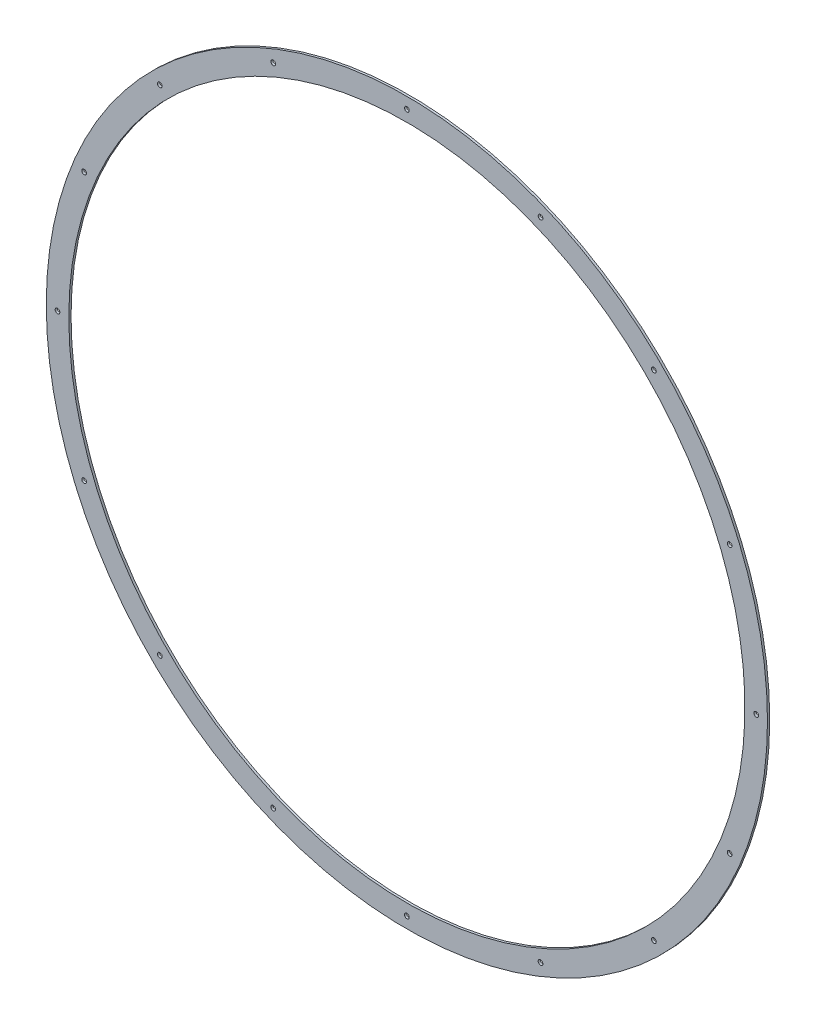
ISO-10303-21;
HEADER;
FILE_DESCRIPTION(('STEP AP214'),'2;1');
FILE_NAME('part.step','',(''),(''),'','','');
FILE_SCHEMA(('AUTOMOTIVE_DESIGN { 1 0 10303 214 1 1 1 1 }'));
ENDSEC;
DATA;
#1=APPLICATION_CONTEXT('core data for automotive mechanical design processes');
#2=APPLICATION_PROTOCOL_DEFINITION('international standard','automotive_design',2000,#1);
#3=PRODUCT_CONTEXT('',#1,'mechanical');
#4=PRODUCT('Part','Part','',(#3));
#5=PRODUCT_RELATED_PRODUCT_CATEGORY('part','',(#4));
#6=PRODUCT_DEFINITION_FORMATION('','',#4);
#7=PRODUCT_DEFINITION_CONTEXT('part definition',#1,'design');
#8=PRODUCT_DEFINITION('design','',#6,#7);
#9=PRODUCT_DEFINITION_SHAPE('','',#8);
#10=(LENGTH_UNIT() NAMED_UNIT(*) SI_UNIT(.MILLI.,.METRE.));
#11=(NAMED_UNIT(*) PLANE_ANGLE_UNIT() SI_UNIT($,.RADIAN.));
#12=(NAMED_UNIT(*) SI_UNIT($,.STERADIAN.) SOLID_ANGLE_UNIT());
#13=UNCERTAINTY_MEASURE_WITH_UNIT(LENGTH_MEASURE(1.E-05),#10,'distance_accuracy_value','');
#14=(GEOMETRIC_REPRESENTATION_CONTEXT(3) GLOBAL_UNCERTAINTY_ASSIGNED_CONTEXT((#13)) GLOBAL_UNIT_ASSIGNED_CONTEXT((#10,
#11,#12)) REPRESENTATION_CONTEXT('',''));
#15=CARTESIAN_POINT('',(0.,0.,0.));
#16=DIRECTION('',(0.,0.,1.));
#17=DIRECTION('',(1.,0.,0.));
#18=AXIS2_PLACEMENT_3D('',#15,#16,#17);
#19=CARTESIAN_POINT('',(-320.,0.,60.));
#20=DIRECTION('',(0.,0.,-1.));
#21=DIRECTION('',(-1.,0.,0.));
#22=AXIS2_PLACEMENT_3D('',#19,#20,#21);
#23=PLANE('',#22);
#24=CARTESIAN_POINT('',(0.,0.,60.));
#25=DIRECTION('',(0.,0.,-1.));
#26=DIRECTION('',(-1.,0.,0.));
#27=AXIS2_PLACEMENT_3D('',#24,#25,#26);
#28=CIRCLE('',#27,300.);
#29=CARTESIAN_POINT('',(-300.,0.,60.));
#30=VERTEX_POINT('',#29);
#31=EDGE_CURVE('E42',#30,#30,#28,.F.);
#32=ORIENTED_EDGE('',*,*,#31,.T.);
#33=EDGE_LOOP('',(#32));
#34=FACE_BOUND('',#33,.T.);
#35=CARTESIAN_POINT('',(-118.631864033174,-286.402655078501,60.));
#36=DIRECTION('',(0.,0.,-1.));
#37=DIRECTION('',(-1.,0.,0.));
#38=AXIS2_PLACEMENT_3D('',#35,#36,#37);
#39=CIRCLE('',#38,2.09999999999998);
#40=CARTESIAN_POINT('',(-120.731864033174,-286.402655078501,60.));
#41=VERTEX_POINT('',#40);
#42=EDGE_CURVE('E148',#41,#41,#39,.T.);
#43=ORIENTED_EDGE('',*,*,#42,.F.);
#44=EDGE_LOOP('',(#43));
#45=FACE_BOUND('',#44,.T.);
#46=CARTESIAN_POINT('',(-219.203102167827,-219.203102167832,60.));
#47=DIRECTION('',(0.,0.,-1.));
#48=DIRECTION('',(-1.,0.,0.));
#49=AXIS2_PLACEMENT_3D('',#46,#47,#48);
#50=CIRCLE('',#49,2.09999999999999);
#51=CARTESIAN_POINT('',(-221.303102167827,-219.203102167832,60.));
#52=VERTEX_POINT('',#51);
#53=EDGE_CURVE('E146',#52,#52,#50,.T.);
#54=ORIENTED_EDGE('',*,*,#53,.F.);
#55=EDGE_LOOP('',(#54));
#56=FACE_BOUND('',#55,.T.);
#57=CARTESIAN_POINT('',(-286.402655078498,-118.631864033181,60.));
#58=DIRECTION('',(0.,0.,-1.));
#59=DIRECTION('',(-1.,0.,0.));
#60=AXIS2_PLACEMENT_3D('',#57,#58,#59);
#61=CIRCLE('',#60,2.09999999999999);
#62=CARTESIAN_POINT('',(-288.502655078498,-118.631864033181,60.));
#63=VERTEX_POINT('',#62);
#64=EDGE_CURVE('E143',#63,#63,#61,.T.);
#65=ORIENTED_EDGE('',*,*,#64,.F.);
#66=EDGE_LOOP('',(#65));
#67=FACE_BOUND('',#66,.T.);
#68=CARTESIAN_POINT('',(-310.,-3.20911359435055E-12,60.));
#69=DIRECTION('',(0.,0.,-1.));
#70=DIRECTION('',(-1.,0.,0.));
#71=AXIS2_PLACEMENT_3D('',#68,#69,#70);
#72=CIRCLE('',#71,2.09999999999999);
#73=CARTESIAN_POINT('',(-312.1,-3.20911359435055E-12,60.));
#74=VERTEX_POINT('',#73);
#75=EDGE_CURVE('E140',#74,#74,#72,.T.);
#76=ORIENTED_EDGE('',*,*,#75,.F.);
#77=EDGE_LOOP('',(#76));
#78=FACE_BOUND('',#77,.T.);
#79=CARTESIAN_POINT('',(-286.4026550785,118.631864033175,60.));
#80=DIRECTION('',(0.,0.,-1.));
#81=DIRECTION('',(-1.,0.,0.));
#82=AXIS2_PLACEMENT_3D('',#79,#80,#81);
#83=CIRCLE('',#82,2.09999999999999);
#84=CARTESIAN_POINT('',(-288.5026550785,118.631864033175,60.));
#85=VERTEX_POINT('',#84);
#86=EDGE_CURVE('E137',#85,#85,#83,.T.);
#87=ORIENTED_EDGE('',*,*,#86,.F.);
#88=EDGE_LOOP('',(#87));
#89=FACE_BOUND('',#88,.T.);
#90=CARTESIAN_POINT('',(-219.203102167832,219.203102167828,60.));
#91=DIRECTION('',(0.,0.,-1.));
#92=DIRECTION('',(-1.,0.,0.));
#93=AXIS2_PLACEMENT_3D('',#90,#91,#92);
#94=CIRCLE('',#93,2.09999999999996);
#95=CARTESIAN_POINT('',(-221.303102167832,219.203102167828,60.));
#96=VERTEX_POINT('',#95);
#97=EDGE_CURVE('E134',#96,#96,#94,.T.);
#98=ORIENTED_EDGE('',*,*,#97,.F.);
#99=EDGE_LOOP('',(#98));
#100=FACE_BOUND('',#99,.T.);
#101=CARTESIAN_POINT('',(-118.63186403318,286.402655078498,60.));
#102=DIRECTION('',(0.,0.,-1.));
#103=DIRECTION('',(-1.,0.,0.));
#104=AXIS2_PLACEMENT_3D('',#101,#102,#103);
#105=CIRCLE('',#104,2.09999999999996);
#106=CARTESIAN_POINT('',(-120.73186403318,286.402655078498,60.));
#107=VERTEX_POINT('',#106);
#108=EDGE_CURVE('E131',#107,#107,#105,.T.);
#109=ORIENTED_EDGE('',*,*,#108,.F.);
#110=EDGE_LOOP('',(#109));
#111=FACE_BOUND('',#110,.T.);
#112=CARTESIAN_POINT('',(0.,310.,60.));
#113=DIRECTION('',(0.,0.,-1.));
#114=DIRECTION('',(-1.,0.,0.));
#115=AXIS2_PLACEMENT_3D('',#112,#113,#114);
#116=CIRCLE('',#115,2.09999999999998);
#117=CARTESIAN_POINT('',(-2.09999999999994,310.,60.));
#118=VERTEX_POINT('',#117);
#119=EDGE_CURVE('E128',#118,#118,#116,.T.);
#120=ORIENTED_EDGE('',*,*,#119,.F.);
#121=EDGE_LOOP('',(#120));
#122=FACE_BOUND('',#121,.T.);
#123=CARTESIAN_POINT('',(118.631864033176,286.4026550785,60.));
#124=DIRECTION('',(0.,0.,-1.));
#125=DIRECTION('',(-1.,0.,0.));
#126=AXIS2_PLACEMENT_3D('',#123,#124,#125);
#127=CIRCLE('',#126,2.09999999999998);
#128=CARTESIAN_POINT('',(116.531864033176,286.4026550785,60.));
#129=VERTEX_POINT('',#128);
#130=EDGE_CURVE('E125',#129,#129,#127,.T.);
#131=ORIENTED_EDGE('',*,*,#130,.F.);
#132=EDGE_LOOP('',(#131));
#133=FACE_BOUND('',#132,.T.);
#134=CARTESIAN_POINT('',(219.203102167829,219.203102167831,60.));
#135=DIRECTION('',(0.,0.,-1.));
#136=DIRECTION('',(-1.,0.,0.));
#137=AXIS2_PLACEMENT_3D('',#134,#135,#136);
#138=CIRCLE('',#137,2.09999999999999);
#139=CARTESIAN_POINT('',(217.103102167829,219.203102167831,60.));
#140=VERTEX_POINT('',#139);
#141=EDGE_CURVE('E122',#140,#140,#138,.T.);
#142=ORIENTED_EDGE('',*,*,#141,.F.);
#143=EDGE_LOOP('',(#142));
#144=FACE_BOUND('',#143,.T.);
#145=CARTESIAN_POINT('',(286.402655078498,118.631864033179,60.));
#146=DIRECTION('',(0.,0.,-1.));
#147=DIRECTION('',(-1.,0.,0.));
#148=AXIS2_PLACEMENT_3D('',#145,#146,#147);
#149=CIRCLE('',#148,2.09999999999999);
#150=CARTESIAN_POINT('',(284.302655078499,118.631864033179,60.));
#151=VERTEX_POINT('',#150);
#152=EDGE_CURVE('E119',#151,#151,#149,.T.);
#153=ORIENTED_EDGE('',*,*,#152,.F.);
#154=EDGE_LOOP('',(#153));
#155=FACE_BOUND('',#154,.T.);
#156=CARTESIAN_POINT('',(310.,1.0443951642678E-12,60.));
#157=DIRECTION('',(0.,0.,-1.));
#158=DIRECTION('',(-1.,0.,0.));
#159=AXIS2_PLACEMENT_3D('',#156,#157,#158);
#160=CIRCLE('',#159,2.09999999999999);
#161=CARTESIAN_POINT('',(307.9,1.0443951642678E-12,60.));
#162=VERTEX_POINT('',#161);
#163=EDGE_CURVE('E116',#162,#162,#160,.T.);
#164=ORIENTED_EDGE('',*,*,#163,.F.);
#165=EDGE_LOOP('',(#164));
#166=FACE_BOUND('',#165,.T.);
#167=CARTESIAN_POINT('',(286.402655078499,-118.631864033177,60.));
#168=DIRECTION('',(0.,0.,-1.));
#169=DIRECTION('',(-1.,0.,0.));
#170=AXIS2_PLACEMENT_3D('',#167,#168,#169);
#171=CIRCLE('',#170,2.09999999999999);
#172=CARTESIAN_POINT('',(284.302655078499,-118.631864033177,60.));
#173=VERTEX_POINT('',#172);
#174=EDGE_CURVE('E113',#173,#173,#171,.T.);
#175=ORIENTED_EDGE('',*,*,#174,.F.);
#176=EDGE_LOOP('',(#175));
#177=FACE_BOUND('',#176,.T.);
#178=CARTESIAN_POINT('',(219.20310216783,-219.203102167829,60.));
#179=DIRECTION('',(0.,0.,-1.));
#180=DIRECTION('',(-1.,0.,0.));
#181=AXIS2_PLACEMENT_3D('',#178,#179,#180);
#182=CIRCLE('',#181,2.09999999999999);
#183=CARTESIAN_POINT('',(217.10310216783,-219.203102167829,60.));
#184=VERTEX_POINT('',#183);
#185=EDGE_CURVE('E110',#184,#184,#182,.T.);
#186=ORIENTED_EDGE('',*,*,#185,.F.);
#187=EDGE_LOOP('',(#186));
#188=FACE_BOUND('',#187,.T.);
#189=CARTESIAN_POINT('',(118.631864033178,-286.402655078499,60.));
#190=DIRECTION('',(0.,0.,-1.));
#191=DIRECTION('',(-1.,0.,0.));
#192=AXIS2_PLACEMENT_3D('',#189,#190,#191);
#193=CIRCLE('',#192,2.09999999999998);
#194=CARTESIAN_POINT('',(116.531864033178,-286.402655078499,60.));
#195=VERTEX_POINT('',#194);
#196=EDGE_CURVE('E107',#195,#195,#193,.T.);
#197=ORIENTED_EDGE('',*,*,#196,.F.);
#198=EDGE_LOOP('',(#197));
#199=FACE_BOUND('',#198,.T.);
#200=CARTESIAN_POINT('',(0.,-310.,60.));
#201=DIRECTION('',(0.,0.,-1.));
#202=DIRECTION('',(-1.,0.,0.));
#203=AXIS2_PLACEMENT_3D('',#200,#201,#202);
#204=CIRCLE('',#203,2.09999999999998);
#205=CARTESIAN_POINT('',(-2.10000000000002,-310.,60.));
#206=VERTEX_POINT('',#205);
#207=EDGE_CURVE('E104',#206,#206,#204,.T.);
#208=ORIENTED_EDGE('',*,*,#207,.F.);
#209=EDGE_LOOP('',(#208));
#210=FACE_BOUND('',#209,.T.);
#211=CARTESIAN_POINT('',(0.,0.,60.));
#212=DIRECTION('',(0.,0.,-1.));
#213=DIRECTION('',(-1.,0.,0.));
#214=AXIS2_PLACEMENT_3D('',#211,#212,#213);
#215=CIRCLE('',#214,320.);
#216=CARTESIAN_POINT('',(-320.,0.,60.));
#217=VERTEX_POINT('',#216);
#218=EDGE_CURVE('E101',#217,#217,#215,.F.);
#219=ORIENTED_EDGE('',*,*,#218,.F.);
#220=EDGE_LOOP('',(#219));
#221=FACE_BOUND('',#220,.T.);
#222=ADVANCED_FACE('F38',(#34,#45,#56,#67,#78,#89,#100,#111,#122,#133,#144,#155,#166,#177,#188,
#199,#210,#221),#23,.T.);
#223=CARTESIAN_POINT('',(0.,0.,62.));
#224=DIRECTION('',(0.,0.,1.));
#225=DIRECTION('',(1.,0.,0.));
#226=AXIS2_PLACEMENT_3D('',#223,#224,#225);
#227=PLANE('',#226);
#228=CARTESIAN_POINT('',(-118.631864033174,-286.402655078501,62.));
#229=DIRECTION('',(0.,0.,-1.));
#230=DIRECTION('',(-1.,0.,0.));
#231=AXIS2_PLACEMENT_3D('',#228,#229,#230);
#232=CIRCLE('',#231,2.09999999999998);
#233=CARTESIAN_POINT('',(-120.731864033174,-286.402655078501,62.));
#234=VERTEX_POINT('',#233);
#235=EDGE_CURVE('E95',#234,#234,#232,.T.);
#236=ORIENTED_EDGE('',*,*,#235,.T.);
#237=EDGE_LOOP('',(#236));
#238=FACE_BOUND('',#237,.T.);
#239=CARTESIAN_POINT('',(-219.203102167827,-219.203102167832,62.));
#240=DIRECTION('',(0.,0.,-1.));
#241=DIRECTION('',(-1.,0.,0.));
#242=AXIS2_PLACEMENT_3D('',#239,#240,#241);
#243=CIRCLE('',#242,2.09999999999999);
#244=CARTESIAN_POINT('',(-221.303102167827,-219.203102167832,62.));
#245=VERTEX_POINT('',#244);
#246=EDGE_CURVE('E92',#245,#245,#243,.T.);
#247=ORIENTED_EDGE('',*,*,#246,.T.);
#248=EDGE_LOOP('',(#247));
#249=FACE_BOUND('',#248,.T.);
#250=CARTESIAN_POINT('',(-286.402655078498,-118.631864033181,62.));
#251=DIRECTION('',(0.,0.,-1.));
#252=DIRECTION('',(-1.,0.,0.));
#253=AXIS2_PLACEMENT_3D('',#250,#251,#252);
#254=CIRCLE('',#253,2.09999999999999);
#255=CARTESIAN_POINT('',(-288.502655078498,-118.631864033181,62.));
#256=VERTEX_POINT('',#255);
#257=EDGE_CURVE('E89',#256,#256,#254,.T.);
#258=ORIENTED_EDGE('',*,*,#257,.T.);
#259=EDGE_LOOP('',(#258));
#260=FACE_BOUND('',#259,.T.);
#261=CARTESIAN_POINT('',(-310.,-3.20911359435055E-12,62.));
#262=DIRECTION('',(0.,0.,-1.));
#263=DIRECTION('',(-1.,0.,0.));
#264=AXIS2_PLACEMENT_3D('',#261,#262,#263);
#265=CIRCLE('',#264,2.09999999999999);
#266=CARTESIAN_POINT('',(-312.1,-3.20911359435055E-12,62.));
#267=VERTEX_POINT('',#266);
#268=EDGE_CURVE('E86',#267,#267,#265,.T.);
#269=ORIENTED_EDGE('',*,*,#268,.T.);
#270=EDGE_LOOP('',(#269));
#271=FACE_BOUND('',#270,.T.);
#272=CARTESIAN_POINT('',(-286.4026550785,118.631864033175,62.));
#273=DIRECTION('',(0.,0.,-1.));
#274=DIRECTION('',(-1.,0.,0.));
#275=AXIS2_PLACEMENT_3D('',#272,#273,#274);
#276=CIRCLE('',#275,2.09999999999999);
#277=CARTESIAN_POINT('',(-288.5026550785,118.631864033175,62.));
#278=VERTEX_POINT('',#277);
#279=EDGE_CURVE('E83',#278,#278,#276,.T.);
#280=ORIENTED_EDGE('',*,*,#279,.T.);
#281=EDGE_LOOP('',(#280));
#282=FACE_BOUND('',#281,.T.);
#283=CARTESIAN_POINT('',(-219.203102167832,219.203102167828,62.));
#284=DIRECTION('',(0.,0.,-1.));
#285=DIRECTION('',(-1.,0.,0.));
#286=AXIS2_PLACEMENT_3D('',#283,#284,#285);
#287=CIRCLE('',#286,2.09999999999996);
#288=CARTESIAN_POINT('',(-221.303102167832,219.203102167828,62.));
#289=VERTEX_POINT('',#288);
#290=EDGE_CURVE('E80',#289,#289,#287,.T.);
#291=ORIENTED_EDGE('',*,*,#290,.T.);
#292=EDGE_LOOP('',(#291));
#293=FACE_BOUND('',#292,.T.);
#294=CARTESIAN_POINT('',(-118.63186403318,286.402655078498,62.));
#295=DIRECTION('',(0.,0.,-1.));
#296=DIRECTION('',(-1.,0.,0.));
#297=AXIS2_PLACEMENT_3D('',#294,#295,#296);
#298=CIRCLE('',#297,2.09999999999996);
#299=CARTESIAN_POINT('',(-120.73186403318,286.402655078498,62.));
#300=VERTEX_POINT('',#299);
#301=EDGE_CURVE('E77',#300,#300,#298,.T.);
#302=ORIENTED_EDGE('',*,*,#301,.T.);
#303=EDGE_LOOP('',(#302));
#304=FACE_BOUND('',#303,.T.);
#305=CARTESIAN_POINT('',(0.,310.,62.));
#306=DIRECTION('',(0.,0.,-1.));
#307=DIRECTION('',(-1.,0.,0.));
#308=AXIS2_PLACEMENT_3D('',#305,#306,#307);
#309=CIRCLE('',#308,2.09999999999998);
#310=CARTESIAN_POINT('',(-2.09999999999994,310.,62.));
#311=VERTEX_POINT('',#310);
#312=EDGE_CURVE('E74',#311,#311,#309,.T.);
#313=ORIENTED_EDGE('',*,*,#312,.T.);
#314=EDGE_LOOP('',(#313));
#315=FACE_BOUND('',#314,.T.);
#316=CARTESIAN_POINT('',(118.631864033176,286.4026550785,62.));
#317=DIRECTION('',(0.,0.,-1.));
#318=DIRECTION('',(-1.,0.,0.));
#319=AXIS2_PLACEMENT_3D('',#316,#317,#318);
#320=CIRCLE('',#319,2.09999999999998);
#321=CARTESIAN_POINT('',(116.531864033176,286.4026550785,62.));
#322=VERTEX_POINT('',#321);
#323=EDGE_CURVE('E71',#322,#322,#320,.T.);
#324=ORIENTED_EDGE('',*,*,#323,.T.);
#325=EDGE_LOOP('',(#324));
#326=FACE_BOUND('',#325,.T.);
#327=CARTESIAN_POINT('',(219.203102167829,219.203102167831,62.));
#328=DIRECTION('',(0.,0.,-1.));
#329=DIRECTION('',(-1.,0.,0.));
#330=AXIS2_PLACEMENT_3D('',#327,#328,#329);
#331=CIRCLE('',#330,2.09999999999999);
#332=CARTESIAN_POINT('',(217.103102167829,219.203102167831,62.));
#333=VERTEX_POINT('',#332);
#334=EDGE_CURVE('E68',#333,#333,#331,.T.);
#335=ORIENTED_EDGE('',*,*,#334,.T.);
#336=EDGE_LOOP('',(#335));
#337=FACE_BOUND('',#336,.T.);
#338=CARTESIAN_POINT('',(286.402655078498,118.631864033179,62.));
#339=DIRECTION('',(0.,0.,-1.));
#340=DIRECTION('',(-1.,0.,0.));
#341=AXIS2_PLACEMENT_3D('',#338,#339,#340);
#342=CIRCLE('',#341,2.09999999999999);
#343=CARTESIAN_POINT('',(284.302655078499,118.631864033179,62.));
#344=VERTEX_POINT('',#343);
#345=EDGE_CURVE('E65',#344,#344,#342,.T.);
#346=ORIENTED_EDGE('',*,*,#345,.T.);
#347=EDGE_LOOP('',(#346));
#348=FACE_BOUND('',#347,.T.);
#349=CARTESIAN_POINT('',(310.,1.0443951642678E-12,62.));
#350=DIRECTION('',(0.,0.,-1.));
#351=DIRECTION('',(-1.,0.,0.));
#352=AXIS2_PLACEMENT_3D('',#349,#350,#351);
#353=CIRCLE('',#352,2.09999999999999);
#354=CARTESIAN_POINT('',(307.9,1.0443951642678E-12,62.));
#355=VERTEX_POINT('',#354);
#356=EDGE_CURVE('E62',#355,#355,#353,.T.);
#357=ORIENTED_EDGE('',*,*,#356,.T.);
#358=EDGE_LOOP('',(#357));
#359=FACE_BOUND('',#358,.T.);
#360=CARTESIAN_POINT('',(286.402655078499,-118.631864033177,62.));
#361=DIRECTION('',(0.,0.,-1.));
#362=DIRECTION('',(-1.,0.,0.));
#363=AXIS2_PLACEMENT_3D('',#360,#361,#362);
#364=CIRCLE('',#363,2.09999999999999);
#365=CARTESIAN_POINT('',(284.302655078499,-118.631864033177,62.));
#366=VERTEX_POINT('',#365);
#367=EDGE_CURVE('E59',#366,#366,#364,.T.);
#368=ORIENTED_EDGE('',*,*,#367,.T.);
#369=EDGE_LOOP('',(#368));
#370=FACE_BOUND('',#369,.T.);
#371=CARTESIAN_POINT('',(219.20310216783,-219.203102167829,62.));
#372=DIRECTION('',(0.,0.,-1.));
#373=DIRECTION('',(-1.,0.,0.));
#374=AXIS2_PLACEMENT_3D('',#371,#372,#373);
#375=CIRCLE('',#374,2.09999999999999);
#376=CARTESIAN_POINT('',(217.10310216783,-219.203102167829,62.));
#377=VERTEX_POINT('',#376);
#378=EDGE_CURVE('E56',#377,#377,#375,.T.);
#379=ORIENTED_EDGE('',*,*,#378,.T.);
#380=EDGE_LOOP('',(#379));
#381=FACE_BOUND('',#380,.T.);
#382=CARTESIAN_POINT('',(118.631864033178,-286.402655078499,62.));
#383=DIRECTION('',(0.,0.,-1.));
#384=DIRECTION('',(-1.,0.,0.));
#385=AXIS2_PLACEMENT_3D('',#382,#383,#384);
#386=CIRCLE('',#385,2.09999999999998);
#387=CARTESIAN_POINT('',(116.531864033178,-286.402655078499,62.));
#388=VERTEX_POINT('',#387);
#389=EDGE_CURVE('E51',#388,#388,#386,.T.);
#390=ORIENTED_EDGE('',*,*,#389,.T.);
#391=EDGE_LOOP('',(#390));
#392=FACE_BOUND('',#391,.T.);
#393=CARTESIAN_POINT('',(0.,-310.,62.));
#394=DIRECTION('',(0.,0.,-1.));
#395=DIRECTION('',(-1.,0.,0.));
#396=AXIS2_PLACEMENT_3D('',#393,#394,#395);
#397=CIRCLE('',#396,2.09999999999998);
#398=CARTESIAN_POINT('',(-2.10000000000002,-310.,62.));
#399=VERTEX_POINT('',#398);
#400=EDGE_CURVE('E46',#399,#399,#397,.T.);
#401=ORIENTED_EDGE('',*,*,#400,.T.);
#402=EDGE_LOOP('',(#401));
#403=FACE_BOUND('',#402,.T.);
#404=CARTESIAN_POINT('',(0.,0.,62.));
#405=DIRECTION('',(0.,0.,-1.));
#406=DIRECTION('',(-1.,0.,0.));
#407=AXIS2_PLACEMENT_3D('',#404,#405,#406);
#408=CIRCLE('',#407,300.);
#409=CARTESIAN_POINT('',(-300.,0.,62.));
#410=VERTEX_POINT('',#409);
#411=EDGE_CURVE('E98',#410,#410,#408,.T.);
#412=ORIENTED_EDGE('',*,*,#411,.T.);
#413=EDGE_LOOP('',(#412));
#414=FACE_BOUND('',#413,.T.);
#415=CARTESIAN_POINT('',(0.,0.,62.));
#416=DIRECTION('',(0.,0.,-1.));
#417=DIRECTION('',(-1.,0.,0.));
#418=AXIS2_PLACEMENT_3D('',#415,#416,#417);
#419=CIRCLE('',#418,320.);
#420=CARTESIAN_POINT('',(-320.,0.,62.));
#421=VERTEX_POINT('',#420);
#422=EDGE_CURVE('E10',#421,#421,#419,.T.);
#423=ORIENTED_EDGE('',*,*,#422,.F.);
#424=EDGE_LOOP('',(#423));
#425=FACE_BOUND('',#424,.T.);
#426=ADVANCED_FACE('F168',(#238,#249,#260,#271,#282,#293,#304,#315,#326,#337,#348,#359,#370,
#381,#392,#403,#414,#425),#227,.T.);
#427=CARTESIAN_POINT('',(0.,0.,62.));
#428=DIRECTION('',(0.,0.,-1.));
#429=DIRECTION('',(-1.,0.,0.));
#430=AXIS2_PLACEMENT_3D('',#427,#428,#429);
#431=CYLINDRICAL_SURFACE('',#430,320.);
#432=ORIENTED_EDGE('',*,*,#422,.T.);
#433=EDGE_LOOP('',(#432));
#434=FACE_BOUND('',#433,.T.);
#435=ORIENTED_EDGE('',*,*,#218,.T.);
#436=EDGE_LOOP('',(#435));
#437=FACE_BOUND('',#436,.T.);
#438=ADVANCED_FACE('F170',(#434,#437),#431,.T.);
#439=CARTESIAN_POINT('',(0.,-310.,62.));
#440=DIRECTION('',(0.,0.,-1.));
#441=DIRECTION('',(-1.,0.,0.));
#442=AXIS2_PLACEMENT_3D('',#439,#440,#441);
#443=CYLINDRICAL_SURFACE('',#442,2.09999999999998);
#444=ORIENTED_EDGE('',*,*,#400,.F.);
#445=EDGE_LOOP('',(#444));
#446=FACE_BOUND('',#445,.T.);
#447=ORIENTED_EDGE('',*,*,#207,.T.);
#448=EDGE_LOOP('',(#447));
#449=FACE_BOUND('',#448,.T.);
#450=ADVANCED_FACE('F176',(#446,#449),#443,.F.);
#451=CARTESIAN_POINT('',(118.631864033178,-286.402655078499,62.));
#452=DIRECTION('',(0.,0.,-1.));
#453=DIRECTION('',(-1.,0.,0.));
#454=AXIS2_PLACEMENT_3D('',#451,#452,#453);
#455=CYLINDRICAL_SURFACE('',#454,2.09999999999998);
#456=ORIENTED_EDGE('',*,*,#389,.F.);
#457=EDGE_LOOP('',(#456));
#458=FACE_BOUND('',#457,.T.);
#459=ORIENTED_EDGE('',*,*,#196,.T.);
#460=EDGE_LOOP('',(#459));
#461=FACE_BOUND('',#460,.T.);
#462=ADVANCED_FACE('F182',(#458,#461),#455,.F.);
#463=CARTESIAN_POINT('',(219.20310216783,-219.203102167829,62.));
#464=DIRECTION('',(0.,0.,-1.));
#465=DIRECTION('',(-1.,0.,0.));
#466=AXIS2_PLACEMENT_3D('',#463,#464,#465);
#467=CYLINDRICAL_SURFACE('',#466,2.09999999999999);
#468=ORIENTED_EDGE('',*,*,#378,.F.);
#469=EDGE_LOOP('',(#468));
#470=FACE_BOUND('',#469,.T.);
#471=ORIENTED_EDGE('',*,*,#185,.T.);
#472=EDGE_LOOP('',(#471));
#473=FACE_BOUND('',#472,.T.);
#474=ADVANCED_FACE('F186',(#470,#473),#467,.F.);
#475=CARTESIAN_POINT('',(286.402655078499,-118.631864033177,62.));
#476=DIRECTION('',(0.,0.,-1.));
#477=DIRECTION('',(-1.,0.,0.));
#478=AXIS2_PLACEMENT_3D('',#475,#476,#477);
#479=CYLINDRICAL_SURFACE('',#478,2.09999999999999);
#480=ORIENTED_EDGE('',*,*,#367,.F.);
#481=EDGE_LOOP('',(#480));
#482=FACE_BOUND('',#481,.T.);
#483=ORIENTED_EDGE('',*,*,#174,.T.);
#484=EDGE_LOOP('',(#483));
#485=FACE_BOUND('',#484,.T.);
#486=ADVANCED_FACE('F190',(#482,#485),#479,.F.);
#487=CARTESIAN_POINT('',(310.,1.0443951642678E-12,62.));
#488=DIRECTION('',(0.,0.,-1.));
#489=DIRECTION('',(-1.,0.,0.));
#490=AXIS2_PLACEMENT_3D('',#487,#488,#489);
#491=CYLINDRICAL_SURFACE('',#490,2.09999999999999);
#492=ORIENTED_EDGE('',*,*,#356,.F.);
#493=EDGE_LOOP('',(#492));
#494=FACE_BOUND('',#493,.T.);
#495=ORIENTED_EDGE('',*,*,#163,.T.);
#496=EDGE_LOOP('',(#495));
#497=FACE_BOUND('',#496,.T.);
#498=ADVANCED_FACE('F194',(#494,#497),#491,.F.);
#499=CARTESIAN_POINT('',(286.402655078498,118.631864033179,62.));
#500=DIRECTION('',(0.,0.,-1.));
#501=DIRECTION('',(-1.,0.,0.));
#502=AXIS2_PLACEMENT_3D('',#499,#500,#501);
#503=CYLINDRICAL_SURFACE('',#502,2.09999999999999);
#504=ORIENTED_EDGE('',*,*,#345,.F.);
#505=EDGE_LOOP('',(#504));
#506=FACE_BOUND('',#505,.T.);
#507=ORIENTED_EDGE('',*,*,#152,.T.);
#508=EDGE_LOOP('',(#507));
#509=FACE_BOUND('',#508,.T.);
#510=ADVANCED_FACE('F198',(#506,#509),#503,.F.);
#511=CARTESIAN_POINT('',(219.203102167829,219.203102167831,62.));
#512=DIRECTION('',(0.,0.,-1.));
#513=DIRECTION('',(-1.,0.,0.));
#514=AXIS2_PLACEMENT_3D('',#511,#512,#513);
#515=CYLINDRICAL_SURFACE('',#514,2.09999999999999);
#516=ORIENTED_EDGE('',*,*,#334,.F.);
#517=EDGE_LOOP('',(#516));
#518=FACE_BOUND('',#517,.T.);
#519=ORIENTED_EDGE('',*,*,#141,.T.);
#520=EDGE_LOOP('',(#519));
#521=FACE_BOUND('',#520,.T.);
#522=ADVANCED_FACE('F202',(#518,#521),#515,.F.);
#523=CARTESIAN_POINT('',(118.631864033176,286.4026550785,62.));
#524=DIRECTION('',(0.,0.,-1.));
#525=DIRECTION('',(-1.,0.,0.));
#526=AXIS2_PLACEMENT_3D('',#523,#524,#525);
#527=CYLINDRICAL_SURFACE('',#526,2.09999999999998);
#528=ORIENTED_EDGE('',*,*,#323,.F.);
#529=EDGE_LOOP('',(#528));
#530=FACE_BOUND('',#529,.T.);
#531=ORIENTED_EDGE('',*,*,#130,.T.);
#532=EDGE_LOOP('',(#531));
#533=FACE_BOUND('',#532,.T.);
#534=ADVANCED_FACE('F206',(#530,#533),#527,.F.);
#535=CARTESIAN_POINT('',(0.,310.,62.));
#536=DIRECTION('',(0.,0.,-1.));
#537=DIRECTION('',(-1.,0.,0.));
#538=AXIS2_PLACEMENT_3D('',#535,#536,#537);
#539=CYLINDRICAL_SURFACE('',#538,2.09999999999998);
#540=ORIENTED_EDGE('',*,*,#312,.F.);
#541=EDGE_LOOP('',(#540));
#542=FACE_BOUND('',#541,.T.);
#543=ORIENTED_EDGE('',*,*,#119,.T.);
#544=EDGE_LOOP('',(#543));
#545=FACE_BOUND('',#544,.T.);
#546=ADVANCED_FACE('F210',(#542,#545),#539,.F.);
#547=CARTESIAN_POINT('',(-118.63186403318,286.402655078498,62.));
#548=DIRECTION('',(0.,0.,-1.));
#549=DIRECTION('',(-1.,0.,0.));
#550=AXIS2_PLACEMENT_3D('',#547,#548,#549);
#551=CYLINDRICAL_SURFACE('',#550,2.09999999999996);
#552=ORIENTED_EDGE('',*,*,#301,.F.);
#553=EDGE_LOOP('',(#552));
#554=FACE_BOUND('',#553,.T.);
#555=ORIENTED_EDGE('',*,*,#108,.T.);
#556=EDGE_LOOP('',(#555));
#557=FACE_BOUND('',#556,.T.);
#558=ADVANCED_FACE('F214',(#554,#557),#551,.F.);
#559=CARTESIAN_POINT('',(-219.203102167832,219.203102167828,62.));
#560=DIRECTION('',(0.,0.,-1.));
#561=DIRECTION('',(-1.,0.,0.));
#562=AXIS2_PLACEMENT_3D('',#559,#560,#561);
#563=CYLINDRICAL_SURFACE('',#562,2.09999999999996);
#564=ORIENTED_EDGE('',*,*,#290,.F.);
#565=EDGE_LOOP('',(#564));
#566=FACE_BOUND('',#565,.T.);
#567=ORIENTED_EDGE('',*,*,#97,.T.);
#568=EDGE_LOOP('',(#567));
#569=FACE_BOUND('',#568,.T.);
#570=ADVANCED_FACE('F218',(#566,#569),#563,.F.);
#571=CARTESIAN_POINT('',(-286.4026550785,118.631864033175,62.));
#572=DIRECTION('',(0.,0.,-1.));
#573=DIRECTION('',(-1.,0.,0.));
#574=AXIS2_PLACEMENT_3D('',#571,#572,#573);
#575=CYLINDRICAL_SURFACE('',#574,2.09999999999999);
#576=ORIENTED_EDGE('',*,*,#279,.F.);
#577=EDGE_LOOP('',(#576));
#578=FACE_BOUND('',#577,.T.);
#579=ORIENTED_EDGE('',*,*,#86,.T.);
#580=EDGE_LOOP('',(#579));
#581=FACE_BOUND('',#580,.T.);
#582=ADVANCED_FACE('F222',(#578,#581),#575,.F.);
#583=CARTESIAN_POINT('',(-310.,-3.20911359435055E-12,62.));
#584=DIRECTION('',(0.,0.,-1.));
#585=DIRECTION('',(-1.,0.,0.));
#586=AXIS2_PLACEMENT_3D('',#583,#584,#585);
#587=CYLINDRICAL_SURFACE('',#586,2.09999999999999);
#588=ORIENTED_EDGE('',*,*,#268,.F.);
#589=EDGE_LOOP('',(#588));
#590=FACE_BOUND('',#589,.T.);
#591=ORIENTED_EDGE('',*,*,#75,.T.);
#592=EDGE_LOOP('',(#591));
#593=FACE_BOUND('',#592,.T.);
#594=ADVANCED_FACE('F226',(#590,#593),#587,.F.);
#595=CARTESIAN_POINT('',(-286.402655078498,-118.631864033181,62.));
#596=DIRECTION('',(0.,0.,-1.));
#597=DIRECTION('',(-1.,0.,0.));
#598=AXIS2_PLACEMENT_3D('',#595,#596,#597);
#599=CYLINDRICAL_SURFACE('',#598,2.09999999999999);
#600=ORIENTED_EDGE('',*,*,#257,.F.);
#601=EDGE_LOOP('',(#600));
#602=FACE_BOUND('',#601,.T.);
#603=ORIENTED_EDGE('',*,*,#64,.T.);
#604=EDGE_LOOP('',(#603));
#605=FACE_BOUND('',#604,.T.);
#606=ADVANCED_FACE('F230',(#602,#605),#599,.F.);
#607=CARTESIAN_POINT('',(-219.203102167827,-219.203102167832,62.));
#608=DIRECTION('',(0.,0.,-1.));
#609=DIRECTION('',(-1.,0.,0.));
#610=AXIS2_PLACEMENT_3D('',#607,#608,#609);
#611=CYLINDRICAL_SURFACE('',#610,2.09999999999999);
#612=ORIENTED_EDGE('',*,*,#246,.F.);
#613=EDGE_LOOP('',(#612));
#614=FACE_BOUND('',#613,.T.);
#615=ORIENTED_EDGE('',*,*,#53,.T.);
#616=EDGE_LOOP('',(#615));
#617=FACE_BOUND('',#616,.T.);
#618=ADVANCED_FACE('F163',(#614,#617),#611,.F.);
#619=CARTESIAN_POINT('',(-118.631864033174,-286.402655078501,62.));
#620=DIRECTION('',(0.,0.,-1.));
#621=DIRECTION('',(-1.,0.,0.));
#622=AXIS2_PLACEMENT_3D('',#619,#620,#621);
#623=CYLINDRICAL_SURFACE('',#622,2.09999999999998);
#624=ORIENTED_EDGE('',*,*,#235,.F.);
#625=EDGE_LOOP('',(#624));
#626=FACE_BOUND('',#625,.T.);
#627=ORIENTED_EDGE('',*,*,#42,.T.);
#628=EDGE_LOOP('',(#627));
#629=FACE_BOUND('',#628,.T.);
#630=ADVANCED_FACE('F158',(#626,#629),#623,.F.);
#631=CARTESIAN_POINT('',(0.,0.,60.));
#632=DIRECTION('',(0.,0.,-1.));
#633=DIRECTION('',(-1.,0.,0.));
#634=AXIS2_PLACEMENT_3D('',#631,#632,#633);
#635=CYLINDRICAL_SURFACE('',#634,300.);
#636=ORIENTED_EDGE('',*,*,#411,.F.);
#637=EDGE_LOOP('',(#636));
#638=FACE_BOUND('',#637,.T.);
#639=ORIENTED_EDGE('',*,*,#31,.F.);
#640=EDGE_LOOP('',(#639));
#641=FACE_BOUND('',#640,.T.);
#642=ADVANCED_FACE('F40',(#638,#641),#635,.F.);
#643=CLOSED_SHELL('',(#222,#426,#438,#450,#462,#474,#486,#498,#510,#522,#534,#546,#558,#570,
#582,#594,#606,#618,#630,#642));
#644=MANIFOLD_SOLID_BREP('B2',#643);
#645=ADVANCED_BREP_SHAPE_REPRESENTATION('',(#18,#644),#14);
#646=SHAPE_DEFINITION_REPRESENTATION(#9,#645);
ENDSEC;
END-ISO-10303-21;
